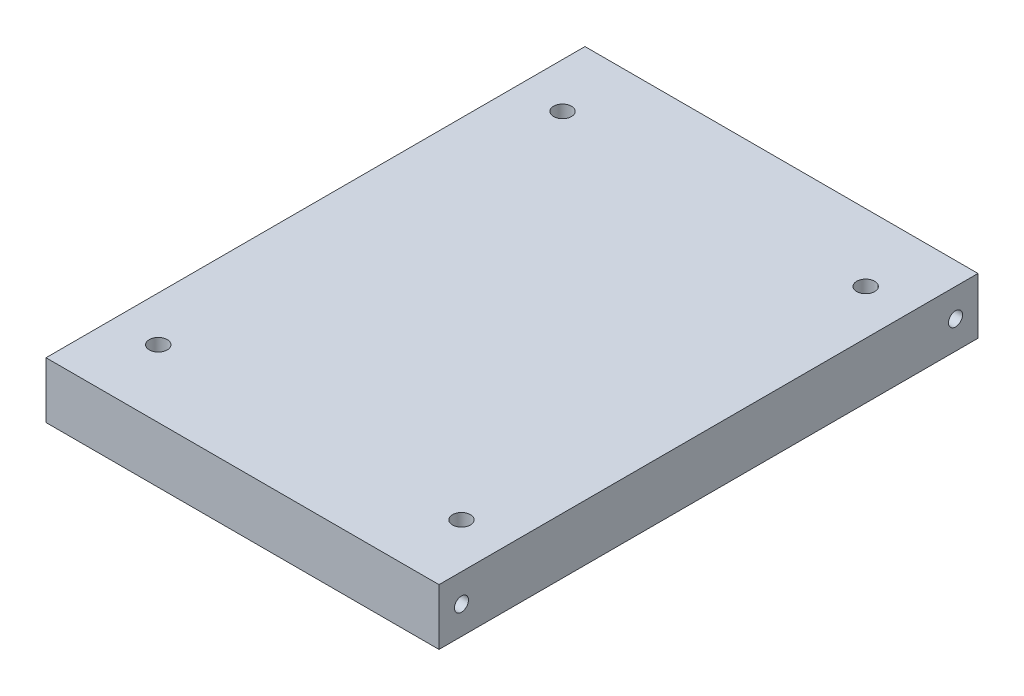
ISO-10303-21;
HEADER;
FILE_DESCRIPTION(('STEP AP214'),'2;1');
FILE_NAME('part.step','',(''),(''),'','','');
FILE_SCHEMA(('AUTOMOTIVE_DESIGN { 1 0 10303 214 1 1 1 1 }'));
ENDSEC;
DATA;
#1=APPLICATION_CONTEXT('core data for automotive mechanical design processes');
#2=APPLICATION_PROTOCOL_DEFINITION('international standard','automotive_design',2000,#1);
#3=PRODUCT_CONTEXT('',#1,'mechanical');
#4=PRODUCT('Part','Part','',(#3));
#5=PRODUCT_RELATED_PRODUCT_CATEGORY('part','',(#4));
#6=PRODUCT_DEFINITION_FORMATION('','',#4);
#7=PRODUCT_DEFINITION_CONTEXT('part definition',#1,'design');
#8=PRODUCT_DEFINITION('design','',#6,#7);
#9=PRODUCT_DEFINITION_SHAPE('','',#8);
#10=(LENGTH_UNIT() NAMED_UNIT(*) SI_UNIT(.MILLI.,.METRE.));
#11=(NAMED_UNIT(*) PLANE_ANGLE_UNIT() SI_UNIT($,.RADIAN.));
#12=(NAMED_UNIT(*) SI_UNIT($,.STERADIAN.) SOLID_ANGLE_UNIT());
#13=UNCERTAINTY_MEASURE_WITH_UNIT(LENGTH_MEASURE(1.E-05),#10,'distance_accuracy_value','');
#14=(GEOMETRIC_REPRESENTATION_CONTEXT(3) GLOBAL_UNCERTAINTY_ASSIGNED_CONTEXT((#13)) GLOBAL_UNIT_ASSIGNED_CONTEXT((#10,
#11,#12)) REPRESENTATION_CONTEXT('',''));
#15=CARTESIAN_POINT('',(0.,0.,0.));
#16=DIRECTION('',(0.,0.,1.));
#17=DIRECTION('',(1.,0.,0.));
#18=AXIS2_PLACEMENT_3D('',#15,#16,#17);
#19=CARTESIAN_POINT('',(0.,306.566699203686,0.));
#20=DIRECTION('',(0.,1.,0.));
#21=DIRECTION('',(0.,0.,1.));
#22=AXIS2_PLACEMENT_3D('',#19,#20,#21);
#23=PLANE('',#22);
#24=DIRECTION('',(0.,0.,1.));
#25=VECTOR('',#24,1.);
#26=CARTESIAN_POINT('',(35.,306.566699203686,-24.4156537702871));
#27=LINE('',#26,#25);
#28=CARTESIAN_POINT('',(35.,306.566699203686,-24.4156537702871));
#29=VERTEX_POINT('',#28);
#30=CARTESIAN_POINT('',(35.,306.566699203686,71.5843462296509));
#31=VERTEX_POINT('',#30);
#32=EDGE_CURVE('E92',#29,#31,#27,.T.);
#33=ORIENTED_EDGE('',*,*,#32,.T.);
#34=DIRECTION('',(-1.,0.,0.));
#35=VECTOR('',#34,1.);
#36=CARTESIAN_POINT('',(-35.,306.566699203686,71.5843462296509));
#37=LINE('',#36,#35);
#38=CARTESIAN_POINT('',(-35.,306.566699203686,71.5843462296509));
#39=VERTEX_POINT('',#38);
#40=EDGE_CURVE('E87',#31,#39,#37,.T.);
#41=ORIENTED_EDGE('',*,*,#40,.T.);
#42=DIRECTION('',(0.,0.,-1.));
#43=VECTOR('',#42,1.);
#44=CARTESIAN_POINT('',(-35.,306.566699203686,-24.4156537702871));
#45=LINE('',#44,#43);
#46=CARTESIAN_POINT('',(-35.,306.566699203686,-24.4156537702871));
#47=VERTEX_POINT('',#46);
#48=EDGE_CURVE('E90',#39,#47,#45,.T.);
#49=ORIENTED_EDGE('',*,*,#48,.T.);
#50=DIRECTION('',(1.,0.,0.));
#51=VECTOR('',#50,1.);
#52=CARTESIAN_POINT('',(-35.,306.566699203686,-24.4156537702871));
#53=LINE('',#52,#51);
#54=EDGE_CURVE('E57',#47,#29,#53,.T.);
#55=ORIENTED_EDGE('',*,*,#54,.T.);
#56=EDGE_LOOP('',(#33,#41,#49,#55));
#57=FACE_BOUND('',#56,.T.);
#58=CARTESIAN_POINT('',(-27.,306.566699203686,59.5843462296819));
#59=DIRECTION('',(0.,-1.,0.));
#60=DIRECTION('',(0.,0.,-1.));
#61=AXIS2_PLACEMENT_3D('',#58,#59,#60);
#62=CIRCLE('',#61,1.60000000000001);
#63=CARTESIAN_POINT('',(-27.,306.566699203686,57.9843462296819));
#64=VERTEX_POINT('',#63);
#65=EDGE_CURVE('E112',#64,#64,#62,.T.);
#66=ORIENTED_EDGE('',*,*,#65,.F.);
#67=EDGE_LOOP('',(#66));
#68=FACE_BOUND('',#67,.T.);
#69=CARTESIAN_POINT('',(27.,306.566699203686,59.5843462296819));
#70=DIRECTION('',(0.,-1.,0.));
#71=DIRECTION('',(0.,0.,-1.));
#72=AXIS2_PLACEMENT_3D('',#69,#70,#71);
#73=CIRCLE('',#72,1.60000000000001);
#74=CARTESIAN_POINT('',(27.,306.566699203686,57.9843462296819));
#75=VERTEX_POINT('',#74);
#76=EDGE_CURVE('E134',#75,#75,#73,.T.);
#77=ORIENTED_EDGE('',*,*,#76,.F.);
#78=EDGE_LOOP('',(#77));
#79=FACE_BOUND('',#78,.T.);
#80=CARTESIAN_POINT('',(-27.,306.566699203686,-12.4156537703181));
#81=DIRECTION('',(0.,-1.,0.));
#82=DIRECTION('',(0.,0.,-1.));
#83=AXIS2_PLACEMENT_3D('',#80,#81,#82);
#84=CIRCLE('',#83,1.6);
#85=CARTESIAN_POINT('',(-27.,306.566699203686,-14.0156537703181));
#86=VERTEX_POINT('',#85);
#87=EDGE_CURVE('E142',#86,#86,#84,.T.);
#88=ORIENTED_EDGE('',*,*,#87,.F.);
#89=EDGE_LOOP('',(#88));
#90=FACE_BOUND('',#89,.T.);
#91=CARTESIAN_POINT('',(27.,306.566699203686,-12.4156537703181));
#92=DIRECTION('',(0.,-1.,0.));
#93=DIRECTION('',(0.,0.,-1.));
#94=AXIS2_PLACEMENT_3D('',#91,#92,#93);
#95=CIRCLE('',#94,1.6);
#96=CARTESIAN_POINT('',(27.,306.566699203686,-14.0156537703181));
#97=VERTEX_POINT('',#96);
#98=EDGE_CURVE('E150',#97,#97,#95,.T.);
#99=ORIENTED_EDGE('',*,*,#98,.F.);
#100=EDGE_LOOP('',(#99));
#101=FACE_BOUND('',#100,.T.);
#102=ADVANCED_FACE('F39',(#57,#68,#79,#90,#101),#23,.F.);
#103=CARTESIAN_POINT('',(0.,316.566699203687,0.));
#104=DIRECTION('',(0.,1.,0.));
#105=DIRECTION('',(0.,0.,1.));
#106=AXIS2_PLACEMENT_3D('',#103,#104,#105);
#107=PLANE('',#106);
#108=CARTESIAN_POINT('',(-27.,316.566699203687,-12.4156537703181));
#109=DIRECTION('',(0.,-1.,0.));
#110=DIRECTION('',(0.,0.,-1.));
#111=AXIS2_PLACEMENT_3D('',#108,#109,#110);
#112=CIRCLE('',#111,1.6);
#113=CARTESIAN_POINT('',(-27.,316.566699203687,-14.0156537703181));
#114=VERTEX_POINT('',#113);
#115=EDGE_CURVE('E146',#114,#114,#112,.T.);
#116=ORIENTED_EDGE('',*,*,#115,.T.);
#117=EDGE_LOOP('',(#116));
#118=FACE_BOUND('',#117,.T.);
#119=CARTESIAN_POINT('',(-27.,316.566699203687,59.5843462296819));
#120=DIRECTION('',(0.,-1.,0.));
#121=DIRECTION('',(0.,0.,-1.));
#122=AXIS2_PLACEMENT_3D('',#119,#120,#121);
#123=CIRCLE('',#122,1.60000000000001);
#124=CARTESIAN_POINT('',(-27.,316.566699203687,57.9843462296819));
#125=VERTEX_POINT('',#124);
#126=EDGE_CURVE('E130',#125,#125,#123,.T.);
#127=ORIENTED_EDGE('',*,*,#126,.T.);
#128=EDGE_LOOP('',(#127));
#129=FACE_BOUND('',#128,.T.);
#130=DIRECTION('',(0.,0.,1.));
#131=VECTOR('',#130,1.);
#132=CARTESIAN_POINT('',(35.,316.566699203687,-24.4156537702871));
#133=LINE('',#132,#131);
#134=CARTESIAN_POINT('',(35.,316.566699203687,-24.4156537702871));
#135=VERTEX_POINT('',#134);
#136=CARTESIAN_POINT('',(35.,316.566699203687,71.5843462296509));
#137=VERTEX_POINT('',#136);
#138=EDGE_CURVE('E108',#135,#137,#133,.T.);
#139=ORIENTED_EDGE('',*,*,#138,.F.);
#140=DIRECTION('',(1.,0.,0.));
#141=VECTOR('',#140,1.);
#142=CARTESIAN_POINT('',(-35.,316.566699203687,-24.4156537702871));
#143=LINE('',#142,#141);
#144=CARTESIAN_POINT('',(-35.,316.566699203687,-24.4156537702871));
#145=VERTEX_POINT('',#144);
#146=EDGE_CURVE('E80',#145,#135,#143,.T.);
#147=ORIENTED_EDGE('',*,*,#146,.F.);
#148=DIRECTION('',(0.,0.,-1.));
#149=VECTOR('',#148,1.);
#150=CARTESIAN_POINT('',(-35.,316.566699203687,-24.4156537702871));
#151=LINE('',#150,#149);
#152=CARTESIAN_POINT('',(-35.,316.566699203687,71.5843462296509));
#153=VERTEX_POINT('',#152);
#154=EDGE_CURVE('E74',#153,#145,#151,.T.);
#155=ORIENTED_EDGE('',*,*,#154,.F.);
#156=DIRECTION('',(-1.,0.,0.));
#157=VECTOR('',#156,1.);
#158=CARTESIAN_POINT('',(-35.,316.566699203687,71.5843462296509));
#159=LINE('',#158,#157);
#160=EDGE_CURVE('E97',#137,#153,#159,.T.);
#161=ORIENTED_EDGE('',*,*,#160,.F.);
#162=EDGE_LOOP('',(#139,#147,#155,#161));
#163=FACE_BOUND('',#162,.T.);
#164=CARTESIAN_POINT('',(27.,316.566699203687,59.5843462296819));
#165=DIRECTION('',(0.,-1.,0.));
#166=DIRECTION('',(0.,0.,-1.));
#167=AXIS2_PLACEMENT_3D('',#164,#165,#166);
#168=CIRCLE('',#167,1.60000000000001);
#169=CARTESIAN_POINT('',(27.,316.566699203687,57.9843462296819));
#170=VERTEX_POINT('',#169);
#171=EDGE_CURVE('E138',#170,#170,#168,.T.);
#172=ORIENTED_EDGE('',*,*,#171,.T.);
#173=EDGE_LOOP('',(#172));
#174=FACE_BOUND('',#173,.T.);
#175=CARTESIAN_POINT('',(27.,316.566699203687,-12.4156537703181));
#176=DIRECTION('',(0.,-1.,0.));
#177=DIRECTION('',(0.,0.,-1.));
#178=AXIS2_PLACEMENT_3D('',#175,#176,#177);
#179=CIRCLE('',#178,1.6);
#180=CARTESIAN_POINT('',(27.,316.566699203687,-14.0156537703181));
#181=VERTEX_POINT('',#180);
#182=EDGE_CURVE('E154',#181,#181,#179,.T.);
#183=ORIENTED_EDGE('',*,*,#182,.T.);
#184=EDGE_LOOP('',(#183));
#185=FACE_BOUND('',#184,.T.);
#186=ADVANCED_FACE('F125',(#118,#129,#163,#174,#185),#107,.T.);
#187=CARTESIAN_POINT('',(35.,306.566699203686,-24.4156537702871));
#188=DIRECTION('',(-1.,0.,0.));
#189=DIRECTION('',(0.,0.,1.));
#190=AXIS2_PLACEMENT_3D('',#187,#188,#189);
#191=PLANE('',#190);
#192=CARTESIAN_POINT('',(35.,311.566699203687,-20.4156537702871));
#193=DIRECTION('',(-1.,0.,0.));
#194=DIRECTION('',(0.,0.,1.));
#195=AXIS2_PLACEMENT_3D('',#192,#193,#194);
#196=CIRCLE('',#195,1.25);
#197=CARTESIAN_POINT('',(35.,311.566699203687,-19.1656537702871));
#198=VERTEX_POINT('',#197);
#199=EDGE_CURVE('E186',#198,#198,#196,.T.);
#200=ORIENTED_EDGE('',*,*,#199,.T.);
#201=EDGE_LOOP('',(#200));
#202=FACE_BOUND('',#201,.T.);
#203=CARTESIAN_POINT('',(35.,311.566699203687,67.5843462296509));
#204=DIRECTION('',(-1.,0.,0.));
#205=DIRECTION('',(0.,0.,1.));
#206=AXIS2_PLACEMENT_3D('',#203,#204,#205);
#207=CIRCLE('',#206,1.25);
#208=CARTESIAN_POINT('',(35.,311.566699203687,68.8343462296509));
#209=VERTEX_POINT('',#208);
#210=EDGE_CURVE('E178',#209,#209,#207,.T.);
#211=ORIENTED_EDGE('',*,*,#210,.T.);
#212=EDGE_LOOP('',(#211));
#213=FACE_BOUND('',#212,.T.);
#214=ORIENTED_EDGE('',*,*,#138,.T.);
#215=DIRECTION('',(0.,1.,0.));
#216=VECTOR('',#215,1.);
#217=CARTESIAN_POINT('',(35.,306.566699203686,71.5843462296509));
#218=LINE('',#217,#216);
#219=EDGE_CURVE('E11',#31,#137,#218,.T.);
#220=ORIENTED_EDGE('',*,*,#219,.F.);
#221=ORIENTED_EDGE('',*,*,#32,.F.);
#222=DIRECTION('',(0.,1.,0.));
#223=VECTOR('',#222,1.);
#224=CARTESIAN_POINT('',(35.,306.566699203686,-24.4156537702871));
#225=LINE('',#224,#223);
#226=EDGE_CURVE('E104',#29,#135,#225,.T.);
#227=ORIENTED_EDGE('',*,*,#226,.T.);
#228=EDGE_LOOP('',(#214,#220,#221,#227));
#229=FACE_BOUND('',#228,.T.);
#230=ADVANCED_FACE('F41',(#202,#213,#229),#191,.F.);
#231=CARTESIAN_POINT('',(-35.,306.566699203686,71.5843462296509));
#232=DIRECTION('',(0.,0.,-1.));
#233=DIRECTION('',(-1.,0.,0.));
#234=AXIS2_PLACEMENT_3D('',#231,#232,#233);
#235=PLANE('',#234);
#236=ORIENTED_EDGE('',*,*,#160,.T.);
#237=DIRECTION('',(0.,1.,0.));
#238=VECTOR('',#237,1.);
#239=CARTESIAN_POINT('',(-35.,306.566699203686,71.5843462296509));
#240=LINE('',#239,#238);
#241=EDGE_CURVE('E49',#39,#153,#240,.T.);
#242=ORIENTED_EDGE('',*,*,#241,.F.);
#243=ORIENTED_EDGE('',*,*,#40,.F.);
#244=ORIENTED_EDGE('',*,*,#219,.T.);
#245=EDGE_LOOP('',(#236,#242,#243,#244));
#246=FACE_BOUND('',#245,.T.);
#247=ADVANCED_FACE('F96',(#246),#235,.F.);
#248=CARTESIAN_POINT('',(-35.,306.566699203686,-24.4156537702871));
#249=DIRECTION('',(1.,0.,0.));
#250=DIRECTION('',(0.,0.,-1.));
#251=AXIS2_PLACEMENT_3D('',#248,#249,#250);
#252=PLANE('',#251);
#253=CARTESIAN_POINT('',(-35.,311.566699203687,-20.4156537702871));
#254=DIRECTION('',(-1.,0.,0.));
#255=DIRECTION('',(0.,0.,1.));
#256=AXIS2_PLACEMENT_3D('',#253,#254,#255);
#257=CIRCLE('',#256,1.25);
#258=CARTESIAN_POINT('',(-35.,311.566699203687,-19.1656537702871));
#259=VERTEX_POINT('',#258);
#260=EDGE_CURVE('E171',#259,#259,#257,.T.);
#261=ORIENTED_EDGE('',*,*,#260,.F.);
#262=EDGE_LOOP('',(#261));
#263=FACE_BOUND('',#262,.T.);
#264=CARTESIAN_POINT('',(-35.,311.566699203687,67.5843462296509));
#265=DIRECTION('',(-1.,0.,0.));
#266=DIRECTION('',(0.,0.,1.));
#267=AXIS2_PLACEMENT_3D('',#264,#265,#266);
#268=CIRCLE('',#267,1.25);
#269=CARTESIAN_POINT('',(-35.,311.566699203687,68.8343462296509));
#270=VERTEX_POINT('',#269);
#271=EDGE_CURVE('E162',#270,#270,#268,.T.);
#272=ORIENTED_EDGE('',*,*,#271,.F.);
#273=EDGE_LOOP('',(#272));
#274=FACE_BOUND('',#273,.T.);
#275=ORIENTED_EDGE('',*,*,#154,.T.);
#276=DIRECTION('',(0.,1.,0.));
#277=VECTOR('',#276,1.);
#278=CARTESIAN_POINT('',(-35.,306.566699203686,-24.4156537702871));
#279=LINE('',#278,#277);
#280=EDGE_CURVE('E99',#47,#145,#279,.T.);
#281=ORIENTED_EDGE('',*,*,#280,.F.);
#282=ORIENTED_EDGE('',*,*,#48,.F.);
#283=ORIENTED_EDGE('',*,*,#241,.T.);
#284=EDGE_LOOP('',(#275,#281,#282,#283));
#285=FACE_BOUND('',#284,.T.);
#286=ADVANCED_FACE('F100',(#263,#274,#285),#252,.F.);
#287=CARTESIAN_POINT('',(-35.,306.566699203686,-24.4156537702871));
#288=DIRECTION('',(0.,0.,1.));
#289=DIRECTION('',(1.,0.,0.));
#290=AXIS2_PLACEMENT_3D('',#287,#288,#289);
#291=PLANE('',#290);
#292=ORIENTED_EDGE('',*,*,#146,.T.);
#293=ORIENTED_EDGE('',*,*,#226,.F.);
#294=ORIENTED_EDGE('',*,*,#54,.F.);
#295=ORIENTED_EDGE('',*,*,#280,.T.);
#296=EDGE_LOOP('',(#292,#293,#294,#295));
#297=FACE_BOUND('',#296,.T.);
#298=ADVANCED_FACE('F122',(#297),#291,.F.);
#299=CARTESIAN_POINT('',(-27.,306.566699203686,59.5843462296819));
#300=DIRECTION('',(0.,1.,0.));
#301=DIRECTION('',(0.,0.,1.));
#302=AXIS2_PLACEMENT_3D('',#299,#300,#301);
#303=CYLINDRICAL_SURFACE('',#302,1.60000000000001);
#304=ORIENTED_EDGE('',*,*,#65,.T.);
#305=EDGE_LOOP('',(#304));
#306=FACE_BOUND('',#305,.T.);
#307=ORIENTED_EDGE('',*,*,#126,.F.);
#308=EDGE_LOOP('',(#307));
#309=FACE_BOUND('',#308,.T.);
#310=ADVANCED_FACE('F213',(#306,#309),#303,.F.);
#311=CARTESIAN_POINT('',(27.,306.566699203686,59.5843462296819));
#312=DIRECTION('',(0.,1.,0.));
#313=DIRECTION('',(0.,0.,1.));
#314=AXIS2_PLACEMENT_3D('',#311,#312,#313);
#315=CYLINDRICAL_SURFACE('',#314,1.60000000000001);
#316=ORIENTED_EDGE('',*,*,#76,.T.);
#317=EDGE_LOOP('',(#316));
#318=FACE_BOUND('',#317,.T.);
#319=ORIENTED_EDGE('',*,*,#171,.F.);
#320=EDGE_LOOP('',(#319));
#321=FACE_BOUND('',#320,.T.);
#322=ADVANCED_FACE('F263',(#318,#321),#315,.F.);
#323=CARTESIAN_POINT('',(-27.,306.566699203686,-12.4156537703181));
#324=DIRECTION('',(0.,1.,0.));
#325=DIRECTION('',(0.,0.,1.));
#326=AXIS2_PLACEMENT_3D('',#323,#324,#325);
#327=CYLINDRICAL_SURFACE('',#326,1.6);
#328=ORIENTED_EDGE('',*,*,#87,.T.);
#329=EDGE_LOOP('',(#328));
#330=FACE_BOUND('',#329,.T.);
#331=ORIENTED_EDGE('',*,*,#115,.F.);
#332=EDGE_LOOP('',(#331));
#333=FACE_BOUND('',#332,.T.);
#334=ADVANCED_FACE('F260',(#330,#333),#327,.F.);
#335=CARTESIAN_POINT('',(27.,306.566699203686,-12.4156537703181));
#336=DIRECTION('',(0.,1.,0.));
#337=DIRECTION('',(0.,0.,1.));
#338=AXIS2_PLACEMENT_3D('',#335,#336,#337);
#339=CYLINDRICAL_SURFACE('',#338,1.6);
#340=ORIENTED_EDGE('',*,*,#98,.T.);
#341=EDGE_LOOP('',(#340));
#342=FACE_BOUND('',#341,.T.);
#343=ORIENTED_EDGE('',*,*,#182,.F.);
#344=EDGE_LOOP('',(#343));
#345=FACE_BOUND('',#344,.T.);
#346=ADVANCED_FACE('F256',(#342,#345),#339,.F.);
#347=CARTESIAN_POINT('',(-25.,311.566699203687,67.5843462296509));
#348=DIRECTION('',(-1.,0.,0.));
#349=DIRECTION('',(0.,0.,1.));
#350=AXIS2_PLACEMENT_3D('',#347,#348,#349);
#351=CYLINDRICAL_SURFACE('',#350,1.25);
#352=CARTESIAN_POINT('',(-25.,311.566699203687,67.5843462296509));
#353=DIRECTION('',(-1.,0.,0.));
#354=DIRECTION('',(0.,0.,1.));
#355=AXIS2_PLACEMENT_3D('',#352,#353,#354);
#356=CIRCLE('',#355,1.25);
#357=CARTESIAN_POINT('',(-25.,311.566699203687,68.8343462296509));
#358=VERTEX_POINT('',#357);
#359=EDGE_CURVE('E166',#358,#358,#356,.T.);
#360=ORIENTED_EDGE('',*,*,#359,.F.);
#361=EDGE_LOOP('',(#360));
#362=FACE_BOUND('',#361,.T.);
#363=ORIENTED_EDGE('',*,*,#271,.T.);
#364=EDGE_LOOP('',(#363));
#365=FACE_BOUND('',#364,.T.);
#366=ADVANCED_FACE('F252',(#362,#365),#351,.F.);
#367=CARTESIAN_POINT('',(-25.,311.566699203687,67.5843462296509));
#368=DIRECTION('',(-1.,0.,0.));
#369=DIRECTION('',(0.,0.,1.));
#370=AXIS2_PLACEMENT_3D('',#367,#368,#369);
#371=PLANE('',#370);
#372=ORIENTED_EDGE('',*,*,#359,.T.);
#373=EDGE_LOOP('',(#372));
#374=FACE_BOUND('',#373,.T.);
#375=ADVANCED_FACE('F248',(#374),#371,.T.);
#376=CARTESIAN_POINT('',(-25.,311.566699203687,-20.4156537702871));
#377=DIRECTION('',(-1.,0.,0.));
#378=DIRECTION('',(0.,0.,1.));
#379=AXIS2_PLACEMENT_3D('',#376,#377,#378);
#380=CYLINDRICAL_SURFACE('',#379,1.25);
#381=CARTESIAN_POINT('',(-25.,311.566699203687,-20.4156537702871));
#382=DIRECTION('',(-1.,0.,0.));
#383=DIRECTION('',(0.,0.,1.));
#384=AXIS2_PLACEMENT_3D('',#381,#382,#383);
#385=CIRCLE('',#384,1.25);
#386=CARTESIAN_POINT('',(-25.,311.566699203687,-19.1656537702871));
#387=VERTEX_POINT('',#386);
#388=EDGE_CURVE('E158',#387,#387,#385,.T.);
#389=ORIENTED_EDGE('',*,*,#388,.F.);
#390=EDGE_LOOP('',(#389));
#391=FACE_BOUND('',#390,.T.);
#392=ORIENTED_EDGE('',*,*,#260,.T.);
#393=EDGE_LOOP('',(#392));
#394=FACE_BOUND('',#393,.T.);
#395=ADVANCED_FACE('F242',(#391,#394),#380,.F.);
#396=CARTESIAN_POINT('',(-25.,311.566699203687,-20.4156537702871));
#397=DIRECTION('',(-1.,0.,0.));
#398=DIRECTION('',(0.,0.,1.));
#399=AXIS2_PLACEMENT_3D('',#396,#397,#398);
#400=PLANE('',#399);
#401=ORIENTED_EDGE('',*,*,#388,.T.);
#402=EDGE_LOOP('',(#401));
#403=FACE_BOUND('',#402,.T.);
#404=ADVANCED_FACE('F233',(#403),#400,.T.);
#405=CARTESIAN_POINT('',(25.,311.566699203687,67.5843462296509));
#406=DIRECTION('',(1.,0.,0.));
#407=DIRECTION('',(0.,0.,-1.));
#408=AXIS2_PLACEMENT_3D('',#405,#406,#407);
#409=CYLINDRICAL_SURFACE('',#408,1.25);
#410=CARTESIAN_POINT('',(25.,311.566699203687,67.5843462296509));
#411=DIRECTION('',(-1.,0.,0.));
#412=DIRECTION('',(0.,0.,1.));
#413=AXIS2_PLACEMENT_3D('',#410,#411,#412);
#414=CIRCLE('',#413,1.25);
#415=CARTESIAN_POINT('',(25.,311.566699203687,68.8343462296509));
#416=VERTEX_POINT('',#415);
#417=EDGE_CURVE('E182',#416,#416,#414,.T.);
#418=ORIENTED_EDGE('',*,*,#417,.T.);
#419=EDGE_LOOP('',(#418));
#420=FACE_BOUND('',#419,.T.);
#421=ORIENTED_EDGE('',*,*,#210,.F.);
#422=EDGE_LOOP('',(#421));
#423=FACE_BOUND('',#422,.T.);
#424=ADVANCED_FACE('F231',(#420,#423),#409,.F.);
#425=CARTESIAN_POINT('',(25.,311.566699203687,67.5843462296509));
#426=DIRECTION('',(1.,0.,0.));
#427=DIRECTION('',(0.,0.,1.));
#428=AXIS2_PLACEMENT_3D('',#425,#426,#427);
#429=PLANE('',#428);
#430=ORIENTED_EDGE('',*,*,#417,.F.);
#431=EDGE_LOOP('',(#430));
#432=FACE_BOUND('',#431,.T.);
#433=ADVANCED_FACE('F203',(#432),#429,.T.);
#434=CARTESIAN_POINT('',(25.,311.566699203687,-20.4156537702871));
#435=DIRECTION('',(1.,0.,0.));
#436=DIRECTION('',(0.,0.,-1.));
#437=AXIS2_PLACEMENT_3D('',#434,#435,#436);
#438=CYLINDRICAL_SURFACE('',#437,1.25);
#439=CARTESIAN_POINT('',(25.,311.566699203687,-20.4156537702871));
#440=DIRECTION('',(-1.,0.,0.));
#441=DIRECTION('',(0.,0.,1.));
#442=AXIS2_PLACEMENT_3D('',#439,#440,#441);
#443=CIRCLE('',#442,1.25);
#444=CARTESIAN_POINT('',(25.,311.566699203687,-19.1656537702871));
#445=VERTEX_POINT('',#444);
#446=EDGE_CURVE('E167',#445,#445,#443,.T.);
#447=ORIENTED_EDGE('',*,*,#446,.T.);
#448=EDGE_LOOP('',(#447));
#449=FACE_BOUND('',#448,.T.);
#450=ORIENTED_EDGE('',*,*,#199,.F.);
#451=EDGE_LOOP('',(#450));
#452=FACE_BOUND('',#451,.T.);
#453=ADVANCED_FACE('F194',(#449,#452),#438,.F.);
#454=CARTESIAN_POINT('',(25.,311.566699203687,-20.4156537702871));
#455=DIRECTION('',(1.,0.,0.));
#456=DIRECTION('',(0.,0.,1.));
#457=AXIS2_PLACEMENT_3D('',#454,#455,#456);
#458=PLANE('',#457);
#459=ORIENTED_EDGE('',*,*,#446,.F.);
#460=EDGE_LOOP('',(#459));
#461=FACE_BOUND('',#460,.T.);
#462=ADVANCED_FACE('F197',(#461),#458,.T.);
#463=CLOSED_SHELL('',(#102,#186,#230,#247,#286,#298,#310,#322,#334,#346,#366,#375,#395,#404,
#424,#433,#453,#462));
#464=MANIFOLD_SOLID_BREP('B2',#463);
#465=ADVANCED_BREP_SHAPE_REPRESENTATION('',(#18,#464),#14);
#466=SHAPE_DEFINITION_REPRESENTATION(#9,#465);
ENDSEC;
END-ISO-10303-21;
